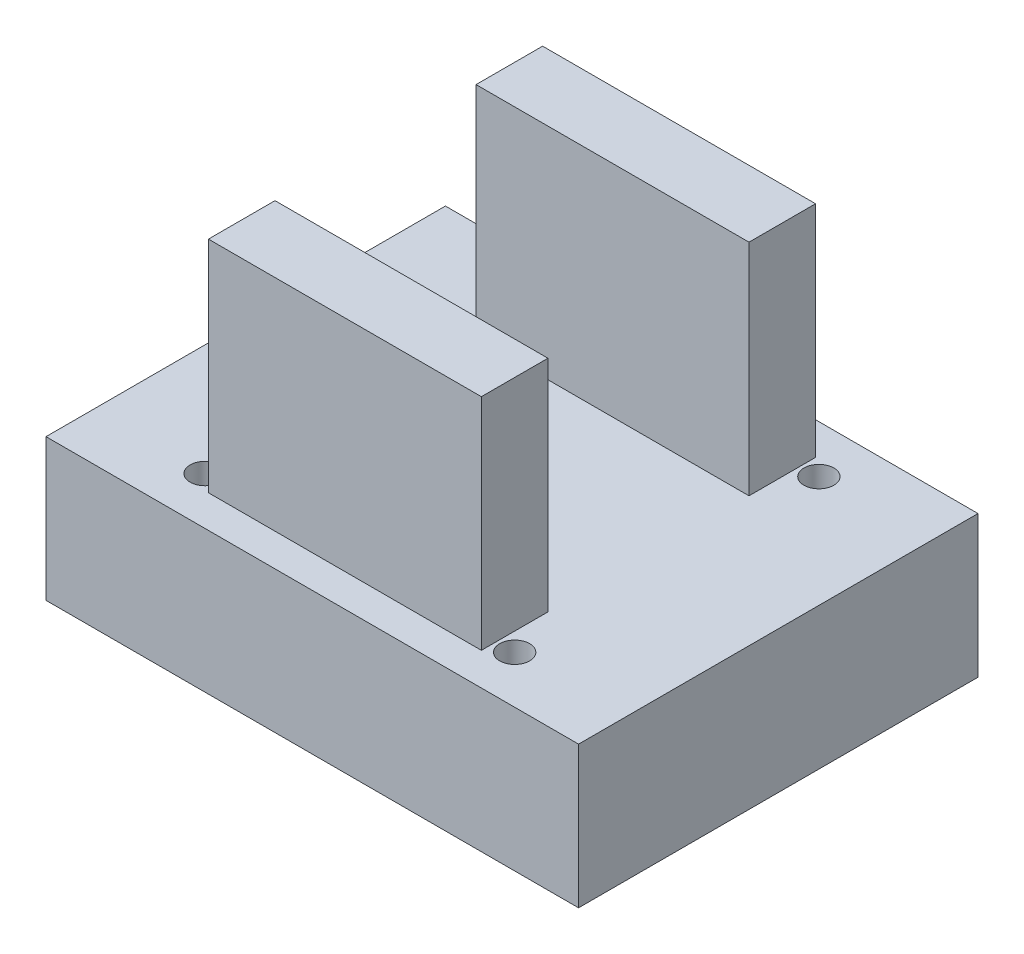
ISO-10303-21;
HEADER;
FILE_DESCRIPTION(('STEP AP214'),'2;1');
FILE_NAME('part.step','',(''),(''),'','','');
FILE_SCHEMA(('AUTOMOTIVE_DESIGN { 1 0 10303 214 1 1 1 1 }'));
ENDSEC;
DATA;
#1=APPLICATION_CONTEXT('core data for automotive mechanical design processes');
#2=APPLICATION_PROTOCOL_DEFINITION('international standard','automotive_design',2000,#1);
#3=PRODUCT_CONTEXT('',#1,'mechanical');
#4=PRODUCT('Part','Part','',(#3));
#5=PRODUCT_RELATED_PRODUCT_CATEGORY('part','',(#4));
#6=PRODUCT_DEFINITION_FORMATION('','',#4);
#7=PRODUCT_DEFINITION_CONTEXT('part definition',#1,'design');
#8=PRODUCT_DEFINITION('design','',#6,#7);
#9=PRODUCT_DEFINITION_SHAPE('','',#8);
#10=(LENGTH_UNIT() NAMED_UNIT(*) SI_UNIT(.MILLI.,.METRE.));
#11=(NAMED_UNIT(*) PLANE_ANGLE_UNIT() SI_UNIT($,.RADIAN.));
#12=(NAMED_UNIT(*) SI_UNIT($,.STERADIAN.) SOLID_ANGLE_UNIT());
#13=UNCERTAINTY_MEASURE_WITH_UNIT(LENGTH_MEASURE(1.E-05),#10,'distance_accuracy_value','');
#14=(GEOMETRIC_REPRESENTATION_CONTEXT(3) GLOBAL_UNCERTAINTY_ASSIGNED_CONTEXT((#13)) GLOBAL_UNIT_ASSIGNED_CONTEXT((#10,
#11,#12)) REPRESENTATION_CONTEXT('',''));
#15=CARTESIAN_POINT('',(0.,0.,0.));
#16=DIRECTION('',(0.,0.,1.));
#17=DIRECTION('',(1.,0.,0.));
#18=AXIS2_PLACEMENT_3D('',#15,#16,#17);
#19=CARTESIAN_POINT('',(0.,5.4102,0.));
#20=DIRECTION('',(0.,-1.,0.));
#21=DIRECTION('',(0.,0.,-1.));
#22=AXIS2_PLACEMENT_3D('',#19,#20,#21);
#23=PLANE('',#22);
#24=CARTESIAN_POINT('',(4.2545,5.4102,-1.8161));
#25=DIRECTION('',(0.,-1.,0.));
#26=DIRECTION('',(0.,0.,-1.));
#27=AXIS2_PLACEMENT_3D('',#24,#25,#26);
#28=CIRCLE('',#27,0.571499999999999);
#29=CARTESIAN_POINT('',(4.2545,5.4102,-2.3876));
#30=VERTEX_POINT('',#29);
#31=EDGE_CURVE('E470',#30,#30,#28,.F.);
#32=ORIENTED_EDGE('',*,*,#31,.F.);
#33=EDGE_LOOP('',(#32));
#34=FACE_BOUND('',#33,.T.);
#35=CARTESIAN_POINT('',(16.0655,5.4102,-1.8161));
#36=DIRECTION('',(0.,-1.,0.));
#37=DIRECTION('',(0.,0.,-1.));
#38=AXIS2_PLACEMENT_3D('',#35,#36,#37);
#39=CIRCLE('',#38,0.571499999999999);
#40=CARTESIAN_POINT('',(16.0655,5.4102,-2.3876));
#41=VERTEX_POINT('',#40);
#42=EDGE_CURVE('E477',#41,#41,#39,.F.);
#43=ORIENTED_EDGE('',*,*,#42,.F.);
#44=EDGE_LOOP('',(#43));
#45=FACE_BOUND('',#44,.T.);
#46=DIRECTION('',(0.,0.,1.));
#47=VECTOR('',#46,1.);
#48=CARTESIAN_POINT('',(4.953,5.4102,-13.9954));
#49=LINE('',#48,#47);
#50=CARTESIAN_POINT('',(4.953,5.4102,-13.9954));
#51=VERTEX_POINT('',#50);
#52=CARTESIAN_POINT('',(4.953,5.4102,-11.4554));
#53=VERTEX_POINT('',#52);
#54=EDGE_CURVE('E128',#51,#53,#49,.T.);
#55=ORIENTED_EDGE('',*,*,#54,.F.);
#56=DIRECTION('',(-1.,0.,0.));
#57=VECTOR('',#56,1.);
#58=CARTESIAN_POINT('',(4.953,5.4102,-13.9954));
#59=LINE('',#58,#57);
#60=CARTESIAN_POINT('',(15.367,5.4102,-13.9954));
#61=VERTEX_POINT('',#60);
#62=EDGE_CURVE('E161',#61,#51,#59,.T.);
#63=ORIENTED_EDGE('',*,*,#62,.F.);
#64=DIRECTION('',(0.,0.,-1.));
#65=VECTOR('',#64,1.);
#66=CARTESIAN_POINT('',(15.367,5.4102,-13.9954));
#67=LINE('',#66,#65);
#68=CARTESIAN_POINT('',(15.367,5.4102,-11.4554));
#69=VERTEX_POINT('',#68);
#70=EDGE_CURVE('E173',#69,#61,#67,.T.);
#71=ORIENTED_EDGE('',*,*,#70,.F.);
#72=DIRECTION('',(1.,0.,0.));
#73=VECTOR('',#72,1.);
#74=CARTESIAN_POINT('',(4.953,5.4102,-11.4554));
#75=LINE('',#74,#73);
#76=EDGE_CURVE('E170',#53,#69,#75,.T.);
#77=ORIENTED_EDGE('',*,*,#76,.F.);
#78=EDGE_LOOP('',(#55,#63,#71,#77));
#79=FACE_BOUND('',#78,.T.);
#80=DIRECTION('',(0.,0.,1.));
#81=VECTOR('',#80,1.);
#82=CARTESIAN_POINT('',(0.,5.4102,0.));
#83=LINE('',#82,#81);
#84=CARTESIAN_POINT('',(0.,5.4102,-15.24));
#85=VERTEX_POINT('',#84);
#86=CARTESIAN_POINT('',(0.,5.4102,0.));
#87=VERTEX_POINT('',#86);
#88=EDGE_CURVE('E190',#85,#87,#83,.T.);
#89=ORIENTED_EDGE('',*,*,#88,.T.);
#90=DIRECTION('',(1.,0.,0.));
#91=VECTOR('',#90,1.);
#92=CARTESIAN_POINT('',(0.,5.4102,0.));
#93=LINE('',#92,#91);
#94=CARTESIAN_POINT('',(20.32,5.4102,0.));
#95=VERTEX_POINT('',#94);
#96=EDGE_CURVE('E193',#87,#95,#93,.T.);
#97=ORIENTED_EDGE('',*,*,#96,.T.);
#98=DIRECTION('',(0.,0.,-1.));
#99=VECTOR('',#98,1.);
#100=CARTESIAN_POINT('',(20.32,5.4102,0.));
#101=LINE('',#100,#99);
#102=CARTESIAN_POINT('',(20.32,5.4102,-15.24));
#103=VERTEX_POINT('',#102);
#104=EDGE_CURVE('E196',#95,#103,#101,.T.);
#105=ORIENTED_EDGE('',*,*,#104,.T.);
#106=DIRECTION('',(-1.,0.,0.));
#107=VECTOR('',#106,1.);
#108=CARTESIAN_POINT('',(0.,5.4102,-15.24));
#109=LINE('',#108,#107);
#110=EDGE_CURVE('E198',#103,#85,#109,.T.);
#111=ORIENTED_EDGE('',*,*,#110,.T.);
#112=EDGE_LOOP('',(#89,#97,#105,#111));
#113=FACE_BOUND('',#112,.T.);
#114=DIRECTION('',(0.,0.,1.));
#115=VECTOR('',#114,1.);
#116=CARTESIAN_POINT('',(4.953,5.4102,-1.2446));
#117=LINE('',#116,#115);
#118=CARTESIAN_POINT('',(4.953,5.4102,-3.7846));
#119=VERTEX_POINT('',#118);
#120=CARTESIAN_POINT('',(4.953,5.4102,-1.2446));
#121=VERTEX_POINT('',#120);
#122=EDGE_CURVE('E121',#119,#121,#117,.T.);
#123=ORIENTED_EDGE('',*,*,#122,.F.);
#124=DIRECTION('',(-1.,0.,0.));
#125=VECTOR('',#124,1.);
#126=CARTESIAN_POINT('',(4.953,5.4102,-3.7846));
#127=LINE('',#126,#125);
#128=CARTESIAN_POINT('',(15.367,5.4102,-3.7846));
#129=VERTEX_POINT('',#128);
#130=EDGE_CURVE('E124',#129,#119,#127,.T.);
#131=ORIENTED_EDGE('',*,*,#130,.F.);
#132=DIRECTION('',(0.,0.,-1.));
#133=VECTOR('',#132,1.);
#134=CARTESIAN_POINT('',(15.367,5.4102,-1.2446));
#135=LINE('',#134,#133);
#136=CARTESIAN_POINT('',(15.367,5.4102,-1.2446));
#137=VERTEX_POINT('',#136);
#138=EDGE_CURVE('E56',#137,#129,#135,.T.);
#139=ORIENTED_EDGE('',*,*,#138,.F.);
#140=DIRECTION('',(1.,0.,0.));
#141=VECTOR('',#140,1.);
#142=CARTESIAN_POINT('',(4.953,5.4102,-1.2446));
#143=LINE('',#142,#141);
#144=EDGE_CURVE('E51',#121,#137,#143,.T.);
#145=ORIENTED_EDGE('',*,*,#144,.F.);
#146=EDGE_LOOP('',(#123,#131,#139,#145));
#147=FACE_BOUND('',#146,.T.);
#148=CARTESIAN_POINT('',(4.2545,5.4102,-13.4239));
#149=DIRECTION('',(0.,-1.,0.));
#150=DIRECTION('',(0.,0.,-1.));
#151=AXIS2_PLACEMENT_3D('',#148,#149,#150);
#152=CIRCLE('',#151,0.5715);
#153=CARTESIAN_POINT('',(4.2545,5.4102,-13.9954));
#154=VERTEX_POINT('',#153);
#155=EDGE_CURVE('E504',#154,#154,#152,.T.);
#156=ORIENTED_EDGE('',*,*,#155,.T.);
#157=EDGE_LOOP('',(#156));
#158=FACE_BOUND('',#157,.T.);
#159=CARTESIAN_POINT('',(16.0655,5.4102,-13.4239));
#160=DIRECTION('',(0.,-1.,0.));
#161=DIRECTION('',(0.,0.,-1.));
#162=AXIS2_PLACEMENT_3D('',#159,#160,#161);
#163=CIRCLE('',#162,0.571499999999999);
#164=CARTESIAN_POINT('',(16.0655,5.4102,-13.9954));
#165=VERTEX_POINT('',#164);
#166=EDGE_CURVE('E483',#165,#165,#163,.T.);
#167=ORIENTED_EDGE('',*,*,#166,.T.);
#168=EDGE_LOOP('',(#167));
#169=FACE_BOUND('',#168,.T.);
#170=ADVANCED_FACE('F36',(#34,#45,#79,#113,#147,#158,#169),#23,.F.);
#171=CARTESIAN_POINT('',(0.,0.,0.));
#172=DIRECTION('',(0.,-1.,0.));
#173=DIRECTION('',(0.,0.,-1.));
#174=AXIS2_PLACEMENT_3D('',#171,#172,#173);
#175=PLANE('',#174);
#176=CARTESIAN_POINT('',(4.2545,0.,-1.8161));
#177=DIRECTION('',(0.,-1.,0.));
#178=DIRECTION('',(0.,0.,-1.));
#179=AXIS2_PLACEMENT_3D('',#176,#177,#178);
#180=CIRCLE('',#179,0.571499999999999);
#181=CARTESIAN_POINT('',(4.2545,0.,-2.3876));
#182=VERTEX_POINT('',#181);
#183=EDGE_CURVE('E473',#182,#182,#180,.T.);
#184=ORIENTED_EDGE('',*,*,#183,.F.);
#185=EDGE_LOOP('',(#184));
#186=FACE_BOUND('',#185,.T.);
#187=CARTESIAN_POINT('',(4.2545,0.,-13.4239));
#188=DIRECTION('',(0.,1.,0.));
#189=DIRECTION('',(0.,0.,1.));
#190=AXIS2_PLACEMENT_3D('',#187,#188,#189);
#191=CIRCLE('',#190,0.5715);
#192=CARTESIAN_POINT('',(4.2545,0.,-12.8524));
#193=VERTEX_POINT('',#192);
#194=EDGE_CURVE('E486',#193,#193,#191,.T.);
#195=ORIENTED_EDGE('',*,*,#194,.T.);
#196=EDGE_LOOP('',(#195));
#197=FACE_BOUND('',#196,.T.);
#198=CARTESIAN_POINT('',(16.0655,0.,-1.8161));
#199=DIRECTION('',(0.,-1.,0.));
#200=DIRECTION('',(0.,0.,-1.));
#201=AXIS2_PLACEMENT_3D('',#198,#199,#200);
#202=CIRCLE('',#201,0.571499999999999);
#203=CARTESIAN_POINT('',(16.0655,0.,-2.3876));
#204=VERTEX_POINT('',#203);
#205=EDGE_CURVE('E474',#204,#204,#202,.T.);
#206=ORIENTED_EDGE('',*,*,#205,.F.);
#207=EDGE_LOOP('',(#206));
#208=FACE_BOUND('',#207,.T.);
#209=DIRECTION('',(0.,0.,1.));
#210=VECTOR('',#209,1.);
#211=CARTESIAN_POINT('',(0.,0.,0.));
#212=LINE('',#211,#210);
#213=CARTESIAN_POINT('',(0.,0.,-15.24));
#214=VERTEX_POINT('',#213);
#215=CARTESIAN_POINT('',(0.,0.,0.));
#216=VERTEX_POINT('',#215);
#217=EDGE_CURVE('E189',#214,#216,#212,.T.);
#218=ORIENTED_EDGE('',*,*,#217,.F.);
#219=DIRECTION('',(-1.,0.,0.));
#220=VECTOR('',#219,1.);
#221=CARTESIAN_POINT('',(0.,0.,-15.24));
#222=LINE('',#221,#220);
#223=CARTESIAN_POINT('',(20.32,0.,-15.24));
#224=VERTEX_POINT('',#223);
#225=EDGE_CURVE('E194',#224,#214,#222,.T.);
#226=ORIENTED_EDGE('',*,*,#225,.F.);
#227=DIRECTION('',(0.,0.,-1.));
#228=VECTOR('',#227,1.);
#229=CARTESIAN_POINT('',(20.32,0.,0.));
#230=LINE('',#229,#228);
#231=CARTESIAN_POINT('',(20.32,0.,0.));
#232=VERTEX_POINT('',#231);
#233=EDGE_CURVE('E205',#232,#224,#230,.T.);
#234=ORIENTED_EDGE('',*,*,#233,.F.);
#235=DIRECTION('',(1.,0.,0.));
#236=VECTOR('',#235,1.);
#237=CARTESIAN_POINT('',(0.,0.,0.));
#238=LINE('',#237,#236);
#239=EDGE_CURVE('E203',#216,#232,#238,.T.);
#240=ORIENTED_EDGE('',*,*,#239,.F.);
#241=EDGE_LOOP('',(#218,#226,#234,#240));
#242=FACE_BOUND('',#241,.T.);
#243=CARTESIAN_POINT('',(16.0655,0.,-13.4239));
#244=DIRECTION('',(0.,1.,0.));
#245=DIRECTION('',(0.,0.,1.));
#246=AXIS2_PLACEMENT_3D('',#243,#244,#245);
#247=CIRCLE('',#246,0.571499999999999);
#248=CARTESIAN_POINT('',(16.0655,0.,-12.8524));
#249=VERTEX_POINT('',#248);
#250=EDGE_CURVE('E479',#249,#249,#247,.T.);
#251=ORIENTED_EDGE('',*,*,#250,.T.);
#252=EDGE_LOOP('',(#251));
#253=FACE_BOUND('',#252,.T.);
#254=ADVANCED_FACE('F223',(#186,#197,#208,#242,#253),#175,.T.);
#255=CARTESIAN_POINT('',(0.,5.4102,0.));
#256=DIRECTION('',(1.,0.,0.));
#257=DIRECTION('',(0.,0.,-1.));
#258=AXIS2_PLACEMENT_3D('',#255,#256,#257);
#259=PLANE('',#258);
#260=ORIENTED_EDGE('',*,*,#217,.T.);
#261=DIRECTION('',(0.,-1.,0.));
#262=VECTOR('',#261,1.);
#263=CARTESIAN_POINT('',(0.,5.4102,0.));
#264=LINE('',#263,#262);
#265=EDGE_CURVE('E11',#87,#216,#264,.T.);
#266=ORIENTED_EDGE('',*,*,#265,.F.);
#267=ORIENTED_EDGE('',*,*,#88,.F.);
#268=DIRECTION('',(0.,-1.,0.));
#269=VECTOR('',#268,1.);
#270=CARTESIAN_POINT('',(0.,5.4102,-15.24));
#271=LINE('',#270,#269);
#272=EDGE_CURVE('E200',#85,#214,#271,.T.);
#273=ORIENTED_EDGE('',*,*,#272,.T.);
#274=EDGE_LOOP('',(#260,#266,#267,#273));
#275=FACE_BOUND('',#274,.T.);
#276=ADVANCED_FACE('F38',(#275),#259,.F.);
#277=CARTESIAN_POINT('',(0.,5.4102,0.));
#278=DIRECTION('',(0.,0.,-1.));
#279=DIRECTION('',(-1.,0.,0.));
#280=AXIS2_PLACEMENT_3D('',#277,#278,#279);
#281=PLANE('',#280);
#282=ORIENTED_EDGE('',*,*,#239,.T.);
#283=DIRECTION('',(0.,-1.,0.));
#284=VECTOR('',#283,1.);
#285=CARTESIAN_POINT('',(20.32,5.4102,0.));
#286=LINE('',#285,#284);
#287=EDGE_CURVE('E44',#95,#232,#286,.T.);
#288=ORIENTED_EDGE('',*,*,#287,.F.);
#289=ORIENTED_EDGE('',*,*,#96,.F.);
#290=ORIENTED_EDGE('',*,*,#265,.T.);
#291=EDGE_LOOP('',(#282,#288,#289,#290));
#292=FACE_BOUND('',#291,.T.);
#293=ADVANCED_FACE('F233',(#292),#281,.F.);
#294=CARTESIAN_POINT('',(20.32,5.4102,0.));
#295=DIRECTION('',(-1.,0.,0.));
#296=DIRECTION('',(0.,0.,1.));
#297=AXIS2_PLACEMENT_3D('',#294,#295,#296);
#298=PLANE('',#297);
#299=ORIENTED_EDGE('',*,*,#233,.T.);
#300=DIRECTION('',(0.,-1.,0.));
#301=VECTOR('',#300,1.);
#302=CARTESIAN_POINT('',(20.32,5.4102,-15.24));
#303=LINE('',#302,#301);
#304=EDGE_CURVE('E210',#103,#224,#303,.T.);
#305=ORIENTED_EDGE('',*,*,#304,.F.);
#306=ORIENTED_EDGE('',*,*,#104,.F.);
#307=ORIENTED_EDGE('',*,*,#287,.T.);
#308=EDGE_LOOP('',(#299,#305,#306,#307));
#309=FACE_BOUND('',#308,.T.);
#310=ADVANCED_FACE('F217',(#309),#298,.F.);
#311=CARTESIAN_POINT('',(0.,5.4102,-15.24));
#312=DIRECTION('',(0.,0.,1.));
#313=DIRECTION('',(1.,0.,0.));
#314=AXIS2_PLACEMENT_3D('',#311,#312,#313);
#315=PLANE('',#314);
#316=ORIENTED_EDGE('',*,*,#225,.T.);
#317=ORIENTED_EDGE('',*,*,#272,.F.);
#318=ORIENTED_EDGE('',*,*,#110,.F.);
#319=ORIENTED_EDGE('',*,*,#304,.T.);
#320=EDGE_LOOP('',(#316,#317,#318,#319));
#321=FACE_BOUND('',#320,.T.);
#322=ADVANCED_FACE('F227',(#321),#315,.F.);
#323=CARTESIAN_POINT('',(4.953,13.7922,-13.9954));
#324=DIRECTION('',(1.,0.,0.));
#325=DIRECTION('',(0.,0.,-1.));
#326=AXIS2_PLACEMENT_3D('',#323,#324,#325);
#327=PLANE('',#326);
#328=ORIENTED_EDGE('',*,*,#54,.T.);
#329=DIRECTION('',(0.,-1.,0.));
#330=VECTOR('',#329,1.);
#331=CARTESIAN_POINT('',(4.953,13.7922,-11.4554));
#332=LINE('',#331,#330);
#333=CARTESIAN_POINT('',(4.953,13.7922,-11.4554));
#334=VERTEX_POINT('',#333);
#335=EDGE_CURVE('E186',#334,#53,#332,.T.);
#336=ORIENTED_EDGE('',*,*,#335,.F.);
#337=DIRECTION('',(0.,0.,1.));
#338=VECTOR('',#337,1.);
#339=CARTESIAN_POINT('',(4.953,13.7922,-13.9954));
#340=LINE('',#339,#338);
#341=CARTESIAN_POINT('',(4.953,13.7922,-13.9954));
#342=VERTEX_POINT('',#341);
#343=EDGE_CURVE('E157',#342,#334,#340,.T.);
#344=ORIENTED_EDGE('',*,*,#343,.F.);
#345=DIRECTION('',(0.,-1.,0.));
#346=VECTOR('',#345,1.);
#347=CARTESIAN_POINT('',(4.953,13.7922,-13.9954));
#348=LINE('',#347,#346);
#349=EDGE_CURVE('E167',#342,#51,#348,.T.);
#350=ORIENTED_EDGE('',*,*,#349,.T.);
#351=EDGE_LOOP('',(#328,#336,#344,#350));
#352=FACE_BOUND('',#351,.T.);
#353=ADVANCED_FACE('F251',(#352),#327,.F.);
#354=CARTESIAN_POINT('',(4.953,13.7922,-11.4554));
#355=DIRECTION('',(0.,0.,-1.));
#356=DIRECTION('',(-1.,0.,0.));
#357=AXIS2_PLACEMENT_3D('',#354,#355,#356);
#358=PLANE('',#357);
#359=ORIENTED_EDGE('',*,*,#76,.T.);
#360=DIRECTION('',(0.,-1.,0.));
#361=VECTOR('',#360,1.);
#362=CARTESIAN_POINT('',(15.367,13.7922,-11.4554));
#363=LINE('',#362,#361);
#364=CARTESIAN_POINT('',(15.367,13.7922,-11.4554));
#365=VERTEX_POINT('',#364);
#366=EDGE_CURVE('E183',#365,#69,#363,.T.);
#367=ORIENTED_EDGE('',*,*,#366,.F.);
#368=DIRECTION('',(1.,0.,0.));
#369=VECTOR('',#368,1.);
#370=CARTESIAN_POINT('',(4.953,13.7922,-11.4554));
#371=LINE('',#370,#369);
#372=EDGE_CURVE('E160',#334,#365,#371,.T.);
#373=ORIENTED_EDGE('',*,*,#372,.F.);
#374=ORIENTED_EDGE('',*,*,#335,.T.);
#375=EDGE_LOOP('',(#359,#367,#373,#374));
#376=FACE_BOUND('',#375,.T.);
#377=ADVANCED_FACE('F258',(#376),#358,.F.);
#378=CARTESIAN_POINT('',(15.367,13.7922,-13.9954));
#379=DIRECTION('',(-1.,0.,0.));
#380=DIRECTION('',(0.,0.,1.));
#381=AXIS2_PLACEMENT_3D('',#378,#379,#380);
#382=PLANE('',#381);
#383=ORIENTED_EDGE('',*,*,#70,.T.);
#384=DIRECTION('',(0.,-1.,0.));
#385=VECTOR('',#384,1.);
#386=CARTESIAN_POINT('',(15.367,13.7922,-13.9954));
#387=LINE('',#386,#385);
#388=CARTESIAN_POINT('',(15.367,13.7922,-13.9954));
#389=VERTEX_POINT('',#388);
#390=EDGE_CURVE('E180',#389,#61,#387,.T.);
#391=ORIENTED_EDGE('',*,*,#390,.F.);
#392=DIRECTION('',(0.,0.,-1.));
#393=VECTOR('',#392,1.);
#394=CARTESIAN_POINT('',(15.367,13.7922,-13.9954));
#395=LINE('',#394,#393);
#396=EDGE_CURVE('E163',#365,#389,#395,.T.);
#397=ORIENTED_EDGE('',*,*,#396,.F.);
#398=ORIENTED_EDGE('',*,*,#366,.T.);
#399=EDGE_LOOP('',(#383,#391,#397,#398));
#400=FACE_BOUND('',#399,.T.);
#401=ADVANCED_FACE('F263',(#400),#382,.F.);
#402=CARTESIAN_POINT('',(4.953,13.7922,-13.9954));
#403=DIRECTION('',(0.,0.,1.));
#404=DIRECTION('',(1.,0.,0.));
#405=AXIS2_PLACEMENT_3D('',#402,#403,#404);
#406=PLANE('',#405);
#407=ORIENTED_EDGE('',*,*,#62,.T.);
#408=ORIENTED_EDGE('',*,*,#349,.F.);
#409=DIRECTION('',(-1.,0.,0.));
#410=VECTOR('',#409,1.);
#411=CARTESIAN_POINT('',(4.953,13.7922,-13.9954));
#412=LINE('',#411,#410);
#413=EDGE_CURVE('E165',#389,#342,#412,.T.);
#414=ORIENTED_EDGE('',*,*,#413,.F.);
#415=ORIENTED_EDGE('',*,*,#390,.T.);
#416=EDGE_LOOP('',(#407,#408,#414,#415));
#417=FACE_BOUND('',#416,.T.);
#418=ADVANCED_FACE('F270',(#417),#406,.F.);
#419=CARTESIAN_POINT('',(0.,13.7922,0.));
#420=DIRECTION('',(0.,1.,0.));
#421=DIRECTION('',(0.,0.,1.));
#422=AXIS2_PLACEMENT_3D('',#419,#420,#421);
#423=PLANE('',#422);
#424=ORIENTED_EDGE('',*,*,#343,.T.);
#425=ORIENTED_EDGE('',*,*,#372,.T.);
#426=ORIENTED_EDGE('',*,*,#396,.T.);
#427=ORIENTED_EDGE('',*,*,#413,.T.);
#428=EDGE_LOOP('',(#424,#425,#426,#427));
#429=FACE_BOUND('',#428,.T.);
#430=ADVANCED_FACE('F277',(#429),#423,.T.);
#431=CARTESIAN_POINT('',(4.953,13.7922,-1.2446));
#432=DIRECTION('',(1.,0.,0.));
#433=DIRECTION('',(0.,0.,-1.));
#434=AXIS2_PLACEMENT_3D('',#431,#432,#433);
#435=PLANE('',#434);
#436=ORIENTED_EDGE('',*,*,#122,.T.);
#437=DIRECTION('',(0.,-1.,0.));
#438=VECTOR('',#437,1.);
#439=CARTESIAN_POINT('',(4.953,13.7922,-1.2446));
#440=LINE('',#439,#438);
#441=CARTESIAN_POINT('',(4.953,13.7922,-1.2446));
#442=VERTEX_POINT('',#441);
#443=EDGE_CURVE('E491',#442,#121,#440,.T.);
#444=ORIENTED_EDGE('',*,*,#443,.F.);
#445=DIRECTION('',(0.,0.,1.));
#446=VECTOR('',#445,1.);
#447=CARTESIAN_POINT('',(4.953,13.7922,-1.2446));
#448=LINE('',#447,#446);
#449=CARTESIAN_POINT('',(4.953,13.7922,-3.7846));
#450=VERTEX_POINT('',#449);
#451=EDGE_CURVE('E139',#450,#442,#448,.T.);
#452=ORIENTED_EDGE('',*,*,#451,.F.);
#453=DIRECTION('',(0.,-1.,0.));
#454=VECTOR('',#453,1.);
#455=CARTESIAN_POINT('',(4.953,13.7922,-3.7846));
#456=LINE('',#455,#454);
#457=EDGE_CURVE('E135',#450,#119,#456,.T.);
#458=ORIENTED_EDGE('',*,*,#457,.T.);
#459=EDGE_LOOP('',(#436,#444,#452,#458));
#460=FACE_BOUND('',#459,.T.);
#461=ADVANCED_FACE('F141',(#460),#435,.F.);
#462=CARTESIAN_POINT('',(4.953,13.7922,-1.2446));
#463=DIRECTION('',(0.,0.,-1.));
#464=DIRECTION('',(-1.,0.,0.));
#465=AXIS2_PLACEMENT_3D('',#462,#463,#464);
#466=PLANE('',#465);
#467=ORIENTED_EDGE('',*,*,#144,.T.);
#468=DIRECTION('',(0.,-1.,0.));
#469=VECTOR('',#468,1.);
#470=CARTESIAN_POINT('',(15.367,13.7922,-1.2446));
#471=LINE('',#470,#469);
#472=CARTESIAN_POINT('',(15.367,13.7922,-1.2446));
#473=VERTEX_POINT('',#472);
#474=EDGE_CURVE('E147',#473,#137,#471,.T.);
#475=ORIENTED_EDGE('',*,*,#474,.F.);
#476=DIRECTION('',(1.,0.,0.));
#477=VECTOR('',#476,1.);
#478=CARTESIAN_POINT('',(4.953,13.7922,-1.2446));
#479=LINE('',#478,#477);
#480=EDGE_CURVE('E154',#442,#473,#479,.T.);
#481=ORIENTED_EDGE('',*,*,#480,.F.);
#482=ORIENTED_EDGE('',*,*,#443,.T.);
#483=EDGE_LOOP('',(#467,#475,#481,#482));
#484=FACE_BOUND('',#483,.T.);
#485=ADVANCED_FACE('F284',(#484),#466,.F.);
#486=CARTESIAN_POINT('',(15.367,13.7922,-1.2446));
#487=DIRECTION('',(-1.,0.,0.));
#488=DIRECTION('',(0.,0.,1.));
#489=AXIS2_PLACEMENT_3D('',#486,#487,#488);
#490=PLANE('',#489);
#491=ORIENTED_EDGE('',*,*,#138,.T.);
#492=DIRECTION('',(0.,-1.,0.));
#493=VECTOR('',#492,1.);
#494=CARTESIAN_POINT('',(15.367,13.7922,-3.7846));
#495=LINE('',#494,#493);
#496=CARTESIAN_POINT('',(15.367,13.7922,-3.7846));
#497=VERTEX_POINT('',#496);
#498=EDGE_CURVE('E138',#497,#129,#495,.T.);
#499=ORIENTED_EDGE('',*,*,#498,.F.);
#500=DIRECTION('',(0.,0.,-1.));
#501=VECTOR('',#500,1.);
#502=CARTESIAN_POINT('',(15.367,13.7922,-1.2446));
#503=LINE('',#502,#501);
#504=EDGE_CURVE('E145',#473,#497,#503,.T.);
#505=ORIENTED_EDGE('',*,*,#504,.F.);
#506=ORIENTED_EDGE('',*,*,#474,.T.);
#507=EDGE_LOOP('',(#491,#499,#505,#506));
#508=FACE_BOUND('',#507,.T.);
#509=ADVANCED_FACE('F322',(#508),#490,.F.);
#510=CARTESIAN_POINT('',(4.953,13.7922,-3.7846));
#511=DIRECTION('',(0.,0.,1.));
#512=DIRECTION('',(1.,0.,0.));
#513=AXIS2_PLACEMENT_3D('',#510,#511,#512);
#514=PLANE('',#513);
#515=ORIENTED_EDGE('',*,*,#130,.T.);
#516=ORIENTED_EDGE('',*,*,#457,.F.);
#517=DIRECTION('',(-1.,0.,0.));
#518=VECTOR('',#517,1.);
#519=CARTESIAN_POINT('',(4.953,13.7922,-3.7846));
#520=LINE('',#519,#518);
#521=EDGE_CURVE('E143',#497,#450,#520,.T.);
#522=ORIENTED_EDGE('',*,*,#521,.F.);
#523=ORIENTED_EDGE('',*,*,#498,.T.);
#524=EDGE_LOOP('',(#515,#516,#522,#523));
#525=FACE_BOUND('',#524,.T.);
#526=ADVANCED_FACE('F133',(#525),#514,.F.);
#527=CARTESIAN_POINT('',(0.,13.7922,0.));
#528=DIRECTION('',(0.,-1.,0.));
#529=DIRECTION('',(0.,0.,-1.));
#530=AXIS2_PLACEMENT_3D('',#527,#528,#529);
#531=PLANE('',#530);
#532=ORIENTED_EDGE('',*,*,#451,.T.);
#533=ORIENTED_EDGE('',*,*,#480,.T.);
#534=ORIENTED_EDGE('',*,*,#504,.T.);
#535=ORIENTED_EDGE('',*,*,#521,.T.);
#536=EDGE_LOOP('',(#532,#533,#534,#535));
#537=FACE_BOUND('',#536,.T.);
#538=ADVANCED_FACE('F288',(#537),#531,.F.);
#539=CARTESIAN_POINT('',(16.0655,7.02664610179245,-1.8161));
#540=DIRECTION('',(0.,-1.,0.));
#541=DIRECTION('',(0.,0.,-1.));
#542=AXIS2_PLACEMENT_3D('',#539,#540,#541);
#543=CYLINDRICAL_SURFACE('',#542,0.571499999999999);
#544=ORIENTED_EDGE('',*,*,#42,.T.);
#545=EDGE_LOOP('',(#544));
#546=FACE_BOUND('',#545,.T.);
#547=ORIENTED_EDGE('',*,*,#205,.T.);
#548=EDGE_LOOP('',(#547));
#549=FACE_BOUND('',#548,.T.);
#550=ADVANCED_FACE('F350',(#546,#549),#543,.F.);
#551=CARTESIAN_POINT('',(4.2545,7.02664610179245,-13.4239));
#552=DIRECTION('',(0.,-1.,0.));
#553=DIRECTION('',(0.,0.,-1.));
#554=AXIS2_PLACEMENT_3D('',#551,#552,#553);
#555=CYLINDRICAL_SURFACE('',#554,0.5715);
#556=ORIENTED_EDGE('',*,*,#155,.F.);
#557=EDGE_LOOP('',(#556));
#558=FACE_BOUND('',#557,.T.);
#559=ORIENTED_EDGE('',*,*,#194,.F.);
#560=EDGE_LOOP('',(#559));
#561=FACE_BOUND('',#560,.T.);
#562=ADVANCED_FACE('F373',(#558,#561),#555,.F.);
#563=CARTESIAN_POINT('',(16.0655,7.02664610179245,-13.4239));
#564=DIRECTION('',(0.,-1.,0.));
#565=DIRECTION('',(0.,0.,-1.));
#566=AXIS2_PLACEMENT_3D('',#563,#564,#565);
#567=CYLINDRICAL_SURFACE('',#566,0.571499999999999);
#568=ORIENTED_EDGE('',*,*,#166,.F.);
#569=EDGE_LOOP('',(#568));
#570=FACE_BOUND('',#569,.T.);
#571=ORIENTED_EDGE('',*,*,#250,.F.);
#572=EDGE_LOOP('',(#571));
#573=FACE_BOUND('',#572,.T.);
#574=ADVANCED_FACE('F384',(#570,#573),#567,.F.);
#575=CARTESIAN_POINT('',(4.2545,7.02664610179245,-1.8161));
#576=DIRECTION('',(0.,-1.,0.));
#577=DIRECTION('',(0.,0.,-1.));
#578=AXIS2_PLACEMENT_3D('',#575,#576,#577);
#579=CYLINDRICAL_SURFACE('',#578,0.571499999999999);
#580=ORIENTED_EDGE('',*,*,#31,.T.);
#581=EDGE_LOOP('',(#580));
#582=FACE_BOUND('',#581,.T.);
#583=ORIENTED_EDGE('',*,*,#183,.T.);
#584=EDGE_LOOP('',(#583));
#585=FACE_BOUND('',#584,.T.);
#586=ADVANCED_FACE('F395',(#582,#585),#579,.F.);
#587=CLOSED_SHELL('',(#170,#254,#276,#293,#310,#322,#353,#377,#401,#418,#430,#461,#485,#509,
#526,#538,#550,#562,#574,#586));
#588=MANIFOLD_SOLID_BREP('B2',#587);
#589=ADVANCED_BREP_SHAPE_REPRESENTATION('',(#18,#588),#14);
#590=SHAPE_DEFINITION_REPRESENTATION(#9,#589);
ENDSEC;
END-ISO-10303-21;
